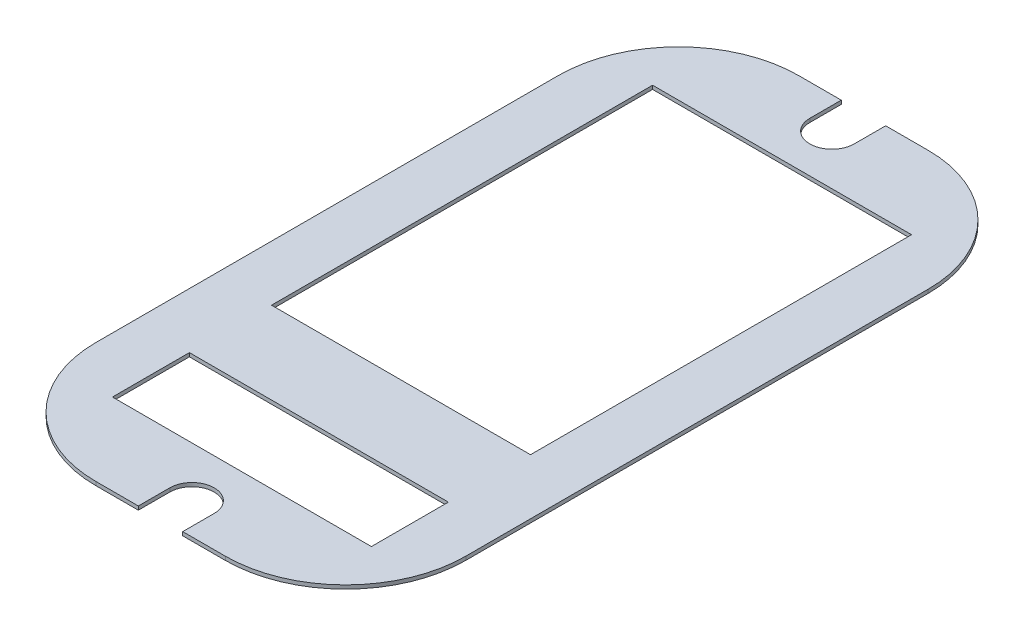
ISO-10303-21;
HEADER;
FILE_DESCRIPTION(('STEP AP214'),'2;1');
FILE_NAME('part.step','',(''),(''),'','','');
FILE_SCHEMA(('AUTOMOTIVE_DESIGN { 1 0 10303 214 1 1 1 1 }'));
ENDSEC;
DATA;
#1=APPLICATION_CONTEXT('core data for automotive mechanical design processes');
#2=APPLICATION_PROTOCOL_DEFINITION('international standard','automotive_design',2000,#1);
#3=PRODUCT_CONTEXT('',#1,'mechanical');
#4=PRODUCT('Part','Part','',(#3));
#5=PRODUCT_RELATED_PRODUCT_CATEGORY('part','',(#4));
#6=PRODUCT_DEFINITION_FORMATION('','',#4);
#7=PRODUCT_DEFINITION_CONTEXT('part definition',#1,'design');
#8=PRODUCT_DEFINITION('design','',#6,#7);
#9=PRODUCT_DEFINITION_SHAPE('','',#8);
#10=(LENGTH_UNIT() NAMED_UNIT(*) SI_UNIT(.MILLI.,.METRE.));
#11=(NAMED_UNIT(*) PLANE_ANGLE_UNIT() SI_UNIT($,.RADIAN.));
#12=(NAMED_UNIT(*) SI_UNIT($,.STERADIAN.) SOLID_ANGLE_UNIT());
#13=UNCERTAINTY_MEASURE_WITH_UNIT(LENGTH_MEASURE(1.E-05),#10,'distance_accuracy_value','');
#14=(GEOMETRIC_REPRESENTATION_CONTEXT(3) GLOBAL_UNCERTAINTY_ASSIGNED_CONTEXT((#13)) GLOBAL_UNIT_ASSIGNED_CONTEXT((#10,
#11,#12)) REPRESENTATION_CONTEXT('',''));
#15=CARTESIAN_POINT('',(0.,0.,0.));
#16=DIRECTION('',(0.,0.,1.));
#17=DIRECTION('',(1.,0.,0.));
#18=AXIS2_PLACEMENT_3D('',#15,#16,#17);
#19=CARTESIAN_POINT('',(0.,0.1,-8.65));
#20=DIRECTION('',(0.,1.,0.));
#21=DIRECTION('',(0.,0.,1.));
#22=AXIS2_PLACEMENT_3D('',#19,#20,#21);
#23=PLANE('',#22);
#24=CARTESIAN_POINT('',(0.,0.1,-8.65));
#25=DIRECTION('',(0.,-1.,0.));
#26=DIRECTION('',(0.,0.,1.));
#27=AXIS2_PLACEMENT_3D('',#24,#25,#26);
#28=CIRCLE('',#27,0.599999999999999);
#29=CARTESIAN_POINT('',(0.599999999999996,0.1,-8.65));
#30=VERTEX_POINT('',#29);
#31=CARTESIAN_POINT('',(-0.600000000000002,0.1,-8.65));
#32=VERTEX_POINT('',#31);
#33=EDGE_CURVE('E261',#30,#32,#28,.T.);
#34=ORIENTED_EDGE('',*,*,#33,.T.);
#35=DIRECTION('',(0.,0.,-1.));
#36=VECTOR('',#35,1.);
#37=CARTESIAN_POINT('',(-0.600000000000005,0.1,-9.5));
#38=LINE('',#37,#36);
#39=CARTESIAN_POINT('',(-0.600000000000005,0.1,-9.5));
#40=VERTEX_POINT('',#39);
#41=EDGE_CURVE('E264',#32,#40,#38,.T.);
#42=ORIENTED_EDGE('',*,*,#41,.T.);
#43=DIRECTION('',(-1.,0.,0.));
#44=VECTOR('',#43,1.);
#45=CARTESIAN_POINT('',(-0.600000000000005,0.1,-9.5));
#46=LINE('',#45,#44);
#47=CARTESIAN_POINT('',(-1.75000000000001,0.1,-9.5));
#48=VERTEX_POINT('',#47);
#49=EDGE_CURVE('E267',#40,#48,#46,.T.);
#50=ORIENTED_EDGE('',*,*,#49,.T.);
#51=CARTESIAN_POINT('',(-1.75000000000001,0.1,-6.25));
#52=DIRECTION('',(0.,1.,0.));
#53=DIRECTION('',(0.,0.,1.));
#54=AXIS2_PLACEMENT_3D('',#51,#52,#53);
#55=CIRCLE('',#54,3.25);
#56=CARTESIAN_POINT('',(-5.,0.1,-6.25));
#57=VERTEX_POINT('',#56);
#58=EDGE_CURVE('E269',#48,#57,#55,.T.);
#59=ORIENTED_EDGE('',*,*,#58,.T.);
#60=DIRECTION('',(0.,0.,1.));
#61=VECTOR('',#60,1.);
#62=CARTESIAN_POINT('',(-5.,0.1,-6.25));
#63=LINE('',#62,#61);
#64=CARTESIAN_POINT('',(-5.,0.1,6.25000000000001));
#65=VERTEX_POINT('',#64);
#66=EDGE_CURVE('E271',#57,#65,#63,.T.);
#67=ORIENTED_EDGE('',*,*,#66,.T.);
#68=CARTESIAN_POINT('',(-1.75000000000001,0.1,6.25000000000001));
#69=DIRECTION('',(0.,1.,0.));
#70=DIRECTION('',(0.,0.,1.));
#71=AXIS2_PLACEMENT_3D('',#68,#69,#70);
#72=CIRCLE('',#71,3.24999999999999);
#73=CARTESIAN_POINT('',(-1.75,0.1,9.5));
#74=VERTEX_POINT('',#73);
#75=EDGE_CURVE('E273',#65,#74,#72,.T.);
#76=ORIENTED_EDGE('',*,*,#75,.T.);
#77=DIRECTION('',(1.,0.,0.));
#78=VECTOR('',#77,1.);
#79=CARTESIAN_POINT('',(-1.75000000000001,0.1,9.5));
#80=LINE('',#79,#78);
#81=CARTESIAN_POINT('',(-0.600000000000005,0.1,9.5));
#82=VERTEX_POINT('',#81);
#83=EDGE_CURVE('E275',#74,#82,#80,.T.);
#84=ORIENTED_EDGE('',*,*,#83,.T.);
#85=DIRECTION('',(0.,0.,-1.));
#86=VECTOR('',#85,1.);
#87=CARTESIAN_POINT('',(-0.599999999999991,0.1,8.65));
#88=LINE('',#87,#86);
#89=CARTESIAN_POINT('',(-0.599999999999991,0.1,8.65));
#90=VERTEX_POINT('',#89);
#91=EDGE_CURVE('E277',#82,#90,#88,.T.);
#92=ORIENTED_EDGE('',*,*,#91,.T.);
#93=CARTESIAN_POINT('',(0.,0.1,8.65));
#94=DIRECTION('',(0.,-1.,0.));
#95=DIRECTION('',(0.,0.,1.));
#96=AXIS2_PLACEMENT_3D('',#93,#94,#95);
#97=CIRCLE('',#96,0.599999999999996);
#98=CARTESIAN_POINT('',(0.599999999999998,0.1,8.65));
#99=VERTEX_POINT('',#98);
#100=EDGE_CURVE('E279',#90,#99,#97,.T.);
#101=ORIENTED_EDGE('',*,*,#100,.T.);
#102=DIRECTION('',(0.,0.,1.));
#103=VECTOR('',#102,1.);
#104=CARTESIAN_POINT('',(0.600000000000001,0.1,8.65));
#105=LINE('',#104,#103);
#106=CARTESIAN_POINT('',(0.599999999999993,0.1,9.5));
#107=VERTEX_POINT('',#106);
#108=EDGE_CURVE('E281',#99,#107,#105,.T.);
#109=ORIENTED_EDGE('',*,*,#108,.T.);
#110=DIRECTION('',(1.,0.,0.));
#111=VECTOR('',#110,1.);
#112=CARTESIAN_POINT('',(0.599999999999993,0.1,9.5));
#113=LINE('',#112,#111);
#114=CARTESIAN_POINT('',(1.75,0.1,9.5));
#115=VERTEX_POINT('',#114);
#116=EDGE_CURVE('E283',#107,#115,#113,.T.);
#117=ORIENTED_EDGE('',*,*,#116,.T.);
#118=CARTESIAN_POINT('',(1.75000000000001,0.1,6.25));
#119=DIRECTION('',(0.,1.,0.));
#120=DIRECTION('',(0.,0.,1.));
#121=AXIS2_PLACEMENT_3D('',#118,#119,#120);
#122=CIRCLE('',#121,3.25);
#123=CARTESIAN_POINT('',(5.,0.1,6.25000000000001));
#124=VERTEX_POINT('',#123);
#125=EDGE_CURVE('E285',#115,#124,#122,.T.);
#126=ORIENTED_EDGE('',*,*,#125,.T.);
#127=DIRECTION('',(0.,0.,-1.));
#128=VECTOR('',#127,1.);
#129=CARTESIAN_POINT('',(5.,0.1,6.25000000000001));
#130=LINE('',#129,#128);
#131=CARTESIAN_POINT('',(5.,0.1,-6.25));
#132=VERTEX_POINT('',#131);
#133=EDGE_CURVE('E287',#124,#132,#130,.T.);
#134=ORIENTED_EDGE('',*,*,#133,.T.);
#135=CARTESIAN_POINT('',(1.75,0.1,-6.25));
#136=DIRECTION('',(0.,1.,0.));
#137=DIRECTION('',(0.,0.,1.));
#138=AXIS2_PLACEMENT_3D('',#135,#136,#137);
#139=CIRCLE('',#138,3.25);
#140=CARTESIAN_POINT('',(1.75,0.1,-9.5));
#141=VERTEX_POINT('',#140);
#142=EDGE_CURVE('E289',#132,#141,#139,.T.);
#143=ORIENTED_EDGE('',*,*,#142,.T.);
#144=DIRECTION('',(-1.,0.,0.));
#145=VECTOR('',#144,1.);
#146=CARTESIAN_POINT('',(1.75,0.1,-9.5));
#147=LINE('',#146,#145);
#148=CARTESIAN_POINT('',(0.599999999999993,0.1,-9.5));
#149=VERTEX_POINT('',#148);
#150=EDGE_CURVE('E291',#141,#149,#147,.T.);
#151=ORIENTED_EDGE('',*,*,#150,.T.);
#152=DIRECTION('',(0.,0.,1.));
#153=VECTOR('',#152,1.);
#154=CARTESIAN_POINT('',(0.599999999999993,0.1,-9.5));
#155=LINE('',#154,#153);
#156=EDGE_CURVE('E293',#149,#30,#155,.T.);
#157=ORIENTED_EDGE('',*,*,#156,.T.);
#158=EDGE_LOOP('',(#34,#42,#50,#59,#67,#76,#84,#92,#101,#109,#117,#126,#134,#143,#151,#157));
#159=FACE_BOUND('',#158,.T.);
#160=DIRECTION('',(1.,0.,0.));
#161=VECTOR('',#160,1.);
#162=CARTESIAN_POINT('',(-3.5,0.1,3.));
#163=LINE('',#162,#161);
#164=CARTESIAN_POINT('',(-3.5,0.1,3.));
#165=VERTEX_POINT('',#164);
#166=CARTESIAN_POINT('',(3.5,0.1,3.));
#167=VERTEX_POINT('',#166);
#168=EDGE_CURVE('E232',#165,#167,#163,.T.);
#169=ORIENTED_EDGE('',*,*,#168,.F.);
#170=DIRECTION('',(0.,0.,1.));
#171=VECTOR('',#170,1.);
#172=CARTESIAN_POINT('',(-3.5,0.1,-7.3));
#173=LINE('',#172,#171);
#174=CARTESIAN_POINT('',(-3.5,0.1,-7.3));
#175=VERTEX_POINT('',#174);
#176=EDGE_CURVE('E230',#175,#165,#173,.T.);
#177=ORIENTED_EDGE('',*,*,#176,.F.);
#178=DIRECTION('',(-1.,0.,0.));
#179=VECTOR('',#178,1.);
#180=CARTESIAN_POINT('',(3.5,0.1,-7.3));
#181=LINE('',#180,#179);
#182=CARTESIAN_POINT('',(3.5,0.1,-7.3));
#183=VERTEX_POINT('',#182);
#184=EDGE_CURVE('E238',#183,#175,#181,.T.);
#185=ORIENTED_EDGE('',*,*,#184,.F.);
#186=DIRECTION('',(0.,0.,-1.));
#187=VECTOR('',#186,1.);
#188=CARTESIAN_POINT('',(3.5,0.1,3.));
#189=LINE('',#188,#187);
#190=EDGE_CURVE('E235',#167,#183,#189,.T.);
#191=ORIENTED_EDGE('',*,*,#190,.F.);
#192=EDGE_LOOP('',(#169,#177,#185,#191));
#193=FACE_BOUND('',#192,.T.);
#194=DIRECTION('',(1.,0.,0.));
#195=VECTOR('',#194,1.);
#196=CARTESIAN_POINT('',(-3.5,0.1,7.3));
#197=LINE('',#196,#195);
#198=CARTESIAN_POINT('',(-3.5,0.1,7.3));
#199=VERTEX_POINT('',#198);
#200=CARTESIAN_POINT('',(3.5,0.1,7.3));
#201=VERTEX_POINT('',#200);
#202=EDGE_CURVE('E202',#199,#201,#197,.T.);
#203=ORIENTED_EDGE('',*,*,#202,.F.);
#204=DIRECTION('',(0.,0.,1.));
#205=VECTOR('',#204,1.);
#206=CARTESIAN_POINT('',(-3.5,0.1,5.22));
#207=LINE('',#206,#205);
#208=CARTESIAN_POINT('',(-3.5,0.1,5.22));
#209=VERTEX_POINT('',#208);
#210=EDGE_CURVE('E194',#209,#199,#207,.T.);
#211=ORIENTED_EDGE('',*,*,#210,.F.);
#212=DIRECTION('',(-1.,0.,0.));
#213=VECTOR('',#212,1.);
#214=CARTESIAN_POINT('',(3.5,0.1,5.22));
#215=LINE('',#214,#213);
#216=CARTESIAN_POINT('',(3.5,0.1,5.22));
#217=VERTEX_POINT('',#216);
#218=EDGE_CURVE('E216',#217,#209,#215,.T.);
#219=ORIENTED_EDGE('',*,*,#218,.F.);
#220=DIRECTION('',(0.,0.,-1.));
#221=VECTOR('',#220,1.);
#222=CARTESIAN_POINT('',(3.5,0.1,7.3));
#223=LINE('',#222,#221);
#224=EDGE_CURVE('E214',#201,#217,#223,.T.);
#225=ORIENTED_EDGE('',*,*,#224,.F.);
#226=EDGE_LOOP('',(#203,#211,#219,#225));
#227=FACE_BOUND('',#226,.T.);
#228=ADVANCED_FACE('F33',(#159,#193,#227),#23,.T.);
#229=CARTESIAN_POINT('',(0.,0.,-8.65));
#230=DIRECTION('',(0.,1.,0.));
#231=DIRECTION('',(0.,0.,1.));
#232=AXIS2_PLACEMENT_3D('',#229,#230,#231);
#233=PLANE('',#232);
#234=DIRECTION('',(0.,0.,1.));
#235=VECTOR('',#234,1.);
#236=CARTESIAN_POINT('',(-3.5,0.,-7.3));
#237=LINE('',#236,#235);
#238=CARTESIAN_POINT('',(-3.5,0.,-7.3));
#239=VERTEX_POINT('',#238);
#240=CARTESIAN_POINT('',(-3.5,0.,3.));
#241=VERTEX_POINT('',#240);
#242=EDGE_CURVE('E210',#239,#241,#237,.T.);
#243=ORIENTED_EDGE('',*,*,#242,.T.);
#244=DIRECTION('',(1.,0.,0.));
#245=VECTOR('',#244,1.);
#246=CARTESIAN_POINT('',(-3.5,0.,3.));
#247=LINE('',#246,#245);
#248=CARTESIAN_POINT('',(3.5,0.,3.));
#249=VERTEX_POINT('',#248);
#250=EDGE_CURVE('E243',#241,#249,#247,.T.);
#251=ORIENTED_EDGE('',*,*,#250,.T.);
#252=DIRECTION('',(0.,0.,-1.));
#253=VECTOR('',#252,1.);
#254=CARTESIAN_POINT('',(3.5,0.,3.));
#255=LINE('',#254,#253);
#256=CARTESIAN_POINT('',(3.5,0.,-7.3));
#257=VERTEX_POINT('',#256);
#258=EDGE_CURVE('E246',#249,#257,#255,.T.);
#259=ORIENTED_EDGE('',*,*,#258,.T.);
#260=DIRECTION('',(-1.,0.,0.));
#261=VECTOR('',#260,1.);
#262=CARTESIAN_POINT('',(3.5,0.,-7.3));
#263=LINE('',#262,#261);
#264=EDGE_CURVE('E233',#257,#239,#263,.T.);
#265=ORIENTED_EDGE('',*,*,#264,.T.);
#266=EDGE_LOOP('',(#243,#251,#259,#265));
#267=FACE_BOUND('',#266,.T.);
#268=CARTESIAN_POINT('',(0.,0.,-8.65));
#269=DIRECTION('',(0.,-1.,0.));
#270=DIRECTION('',(0.,0.,1.));
#271=AXIS2_PLACEMENT_3D('',#268,#269,#270);
#272=CIRCLE('',#271,0.599999999999999);
#273=CARTESIAN_POINT('',(0.599999999999996,0.,-8.65));
#274=VERTEX_POINT('',#273);
#275=CARTESIAN_POINT('',(-0.600000000000002,0.,-8.65));
#276=VERTEX_POINT('',#275);
#277=EDGE_CURVE('E260',#274,#276,#272,.T.);
#278=ORIENTED_EDGE('',*,*,#277,.F.);
#279=DIRECTION('',(0.,0.,1.));
#280=VECTOR('',#279,1.);
#281=CARTESIAN_POINT('',(0.599999999999993,0.,-9.5));
#282=LINE('',#281,#280);
#283=CARTESIAN_POINT('',(0.599999999999993,0.,-9.5));
#284=VERTEX_POINT('',#283);
#285=EDGE_CURVE('E265',#284,#274,#282,.T.);
#286=ORIENTED_EDGE('',*,*,#285,.F.);
#287=DIRECTION('',(-1.,0.,0.));
#288=VECTOR('',#287,1.);
#289=CARTESIAN_POINT('',(1.75,0.,-9.5));
#290=LINE('',#289,#288);
#291=CARTESIAN_POINT('',(1.75,0.,-9.5));
#292=VERTEX_POINT('',#291);
#293=EDGE_CURVE('E324',#292,#284,#290,.T.);
#294=ORIENTED_EDGE('',*,*,#293,.F.);
#295=CARTESIAN_POINT('',(1.75,0.,-6.25));
#296=DIRECTION('',(0.,1.,0.));
#297=DIRECTION('',(0.,0.,1.));
#298=AXIS2_PLACEMENT_3D('',#295,#296,#297);
#299=CIRCLE('',#298,3.25);
#300=CARTESIAN_POINT('',(5.,0.,-6.25));
#301=VERTEX_POINT('',#300);
#302=EDGE_CURVE('E322',#301,#292,#299,.T.);
#303=ORIENTED_EDGE('',*,*,#302,.F.);
#304=DIRECTION('',(0.,0.,-1.));
#305=VECTOR('',#304,1.);
#306=CARTESIAN_POINT('',(5.,0.,6.25000000000001));
#307=LINE('',#306,#305);
#308=CARTESIAN_POINT('',(5.,0.,6.25000000000001));
#309=VERTEX_POINT('',#308);
#310=EDGE_CURVE('E320',#309,#301,#307,.T.);
#311=ORIENTED_EDGE('',*,*,#310,.F.);
#312=CARTESIAN_POINT('',(1.75000000000001,0.,6.25));
#313=DIRECTION('',(0.,1.,0.));
#314=DIRECTION('',(0.,0.,1.));
#315=AXIS2_PLACEMENT_3D('',#312,#313,#314);
#316=CIRCLE('',#315,3.25);
#317=CARTESIAN_POINT('',(1.75,0.,9.5));
#318=VERTEX_POINT('',#317);
#319=EDGE_CURVE('E318',#318,#309,#316,.T.);
#320=ORIENTED_EDGE('',*,*,#319,.F.);
#321=DIRECTION('',(1.,0.,0.));
#322=VECTOR('',#321,1.);
#323=CARTESIAN_POINT('',(0.599999999999993,0.,9.5));
#324=LINE('',#323,#322);
#325=CARTESIAN_POINT('',(0.599999999999993,0.,9.5));
#326=VERTEX_POINT('',#325);
#327=EDGE_CURVE('E316',#326,#318,#324,.T.);
#328=ORIENTED_EDGE('',*,*,#327,.F.);
#329=DIRECTION('',(0.,0.,1.));
#330=VECTOR('',#329,1.);
#331=CARTESIAN_POINT('',(0.600000000000001,0.,8.65));
#332=LINE('',#331,#330);
#333=CARTESIAN_POINT('',(0.599999999999998,0.,8.65));
#334=VERTEX_POINT('',#333);
#335=EDGE_CURVE('E314',#334,#326,#332,.T.);
#336=ORIENTED_EDGE('',*,*,#335,.F.);
#337=CARTESIAN_POINT('',(0.,0.,8.65));
#338=DIRECTION('',(0.,-1.,0.));
#339=DIRECTION('',(0.,0.,1.));
#340=AXIS2_PLACEMENT_3D('',#337,#338,#339);
#341=CIRCLE('',#340,0.599999999999996);
#342=CARTESIAN_POINT('',(-0.599999999999991,0.,8.65));
#343=VERTEX_POINT('',#342);
#344=EDGE_CURVE('E312',#343,#334,#341,.T.);
#345=ORIENTED_EDGE('',*,*,#344,.F.);
#346=DIRECTION('',(0.,0.,-1.));
#347=VECTOR('',#346,1.);
#348=CARTESIAN_POINT('',(-0.599999999999991,0.,8.65));
#349=LINE('',#348,#347);
#350=CARTESIAN_POINT('',(-0.600000000000005,0.,9.5));
#351=VERTEX_POINT('',#350);
#352=EDGE_CURVE('E310',#351,#343,#349,.T.);
#353=ORIENTED_EDGE('',*,*,#352,.F.);
#354=DIRECTION('',(1.,0.,0.));
#355=VECTOR('',#354,1.);
#356=CARTESIAN_POINT('',(-1.75000000000001,0.,9.5));
#357=LINE('',#356,#355);
#358=CARTESIAN_POINT('',(-1.75,0.,9.5));
#359=VERTEX_POINT('',#358);
#360=EDGE_CURVE('E308',#359,#351,#357,.T.);
#361=ORIENTED_EDGE('',*,*,#360,.F.);
#362=CARTESIAN_POINT('',(-1.75000000000001,0.,6.25000000000001));
#363=DIRECTION('',(0.,1.,0.));
#364=DIRECTION('',(0.,0.,1.));
#365=AXIS2_PLACEMENT_3D('',#362,#363,#364);
#366=CIRCLE('',#365,3.24999999999999);
#367=CARTESIAN_POINT('',(-5.,0.,6.25000000000001));
#368=VERTEX_POINT('',#367);
#369=EDGE_CURVE('E306',#368,#359,#366,.T.);
#370=ORIENTED_EDGE('',*,*,#369,.F.);
#371=DIRECTION('',(0.,0.,1.));
#372=VECTOR('',#371,1.);
#373=CARTESIAN_POINT('',(-5.,0.,-6.25));
#374=LINE('',#373,#372);
#375=CARTESIAN_POINT('',(-5.,0.,-6.25));
#376=VERTEX_POINT('',#375);
#377=EDGE_CURVE('E304',#376,#368,#374,.T.);
#378=ORIENTED_EDGE('',*,*,#377,.F.);
#379=CARTESIAN_POINT('',(-1.75000000000001,0.,-6.25));
#380=DIRECTION('',(0.,1.,0.));
#381=DIRECTION('',(0.,0.,1.));
#382=AXIS2_PLACEMENT_3D('',#379,#380,#381);
#383=CIRCLE('',#382,3.25);
#384=CARTESIAN_POINT('',(-1.75000000000001,0.,-9.5));
#385=VERTEX_POINT('',#384);
#386=EDGE_CURVE('E302',#385,#376,#383,.T.);
#387=ORIENTED_EDGE('',*,*,#386,.F.);
#388=DIRECTION('',(-1.,0.,0.));
#389=VECTOR('',#388,1.);
#390=CARTESIAN_POINT('',(-0.600000000000005,0.,-9.5));
#391=LINE('',#390,#389);
#392=CARTESIAN_POINT('',(-0.600000000000005,0.,-9.5));
#393=VERTEX_POINT('',#392);
#394=EDGE_CURVE('E300',#393,#385,#391,.T.);
#395=ORIENTED_EDGE('',*,*,#394,.F.);
#396=DIRECTION('',(0.,0.,-1.));
#397=VECTOR('',#396,1.);
#398=CARTESIAN_POINT('',(-0.600000000000005,0.,-9.5));
#399=LINE('',#398,#397);
#400=EDGE_CURVE('E298',#276,#393,#399,.T.);
#401=ORIENTED_EDGE('',*,*,#400,.F.);
#402=EDGE_LOOP('',(#278,#286,#294,#303,#311,#320,#328,#336,#345,#353,#361,#370,#378,#387,#395,#401));
#403=FACE_BOUND('',#402,.T.);
#404=DIRECTION('',(0.,0.,1.));
#405=VECTOR('',#404,1.);
#406=CARTESIAN_POINT('',(-3.5,0.,5.22));
#407=LINE('',#406,#405);
#408=CARTESIAN_POINT('',(-3.5,0.,5.22));
#409=VERTEX_POINT('',#408);
#410=CARTESIAN_POINT('',(-3.5,0.,7.3));
#411=VERTEX_POINT('',#410);
#412=EDGE_CURVE('E56',#409,#411,#407,.T.);
#413=ORIENTED_EDGE('',*,*,#412,.T.);
#414=DIRECTION('',(1.,0.,0.));
#415=VECTOR('',#414,1.);
#416=CARTESIAN_POINT('',(-3.5,0.,7.3));
#417=LINE('',#416,#415);
#418=CARTESIAN_POINT('',(3.5,0.,7.3));
#419=VERTEX_POINT('',#418);
#420=EDGE_CURVE('E209',#411,#419,#417,.T.);
#421=ORIENTED_EDGE('',*,*,#420,.T.);
#422=DIRECTION('',(0.,0.,-1.));
#423=VECTOR('',#422,1.);
#424=CARTESIAN_POINT('',(3.5,0.,7.3));
#425=LINE('',#424,#423);
#426=CARTESIAN_POINT('',(3.5,0.,5.22));
#427=VERTEX_POINT('',#426);
#428=EDGE_CURVE('E222',#419,#427,#425,.T.);
#429=ORIENTED_EDGE('',*,*,#428,.T.);
#430=DIRECTION('',(-1.,0.,0.));
#431=VECTOR('',#430,1.);
#432=CARTESIAN_POINT('',(3.5,0.,5.22));
#433=LINE('',#432,#431);
#434=EDGE_CURVE('E203',#427,#409,#433,.T.);
#435=ORIENTED_EDGE('',*,*,#434,.T.);
#436=EDGE_LOOP('',(#413,#421,#429,#435));
#437=FACE_BOUND('',#436,.T.);
#438=ADVANCED_FACE('F378',(#267,#403,#437),#233,.F.);
#439=CARTESIAN_POINT('',(0.,0.1,-8.65));
#440=DIRECTION('',(0.,-1.,0.));
#441=DIRECTION('',(0.,0.,-1.));
#442=AXIS2_PLACEMENT_3D('',#439,#440,#441);
#443=CYLINDRICAL_SURFACE('',#442,0.599999999999999);
#444=ORIENTED_EDGE('',*,*,#277,.T.);
#445=DIRECTION('',(0.,-1.,0.));
#446=VECTOR('',#445,1.);
#447=CARTESIAN_POINT('',(-0.600000000000002,0.1,-8.65));
#448=LINE('',#447,#446);
#449=EDGE_CURVE('E11',#32,#276,#448,.T.);
#450=ORIENTED_EDGE('',*,*,#449,.F.);
#451=ORIENTED_EDGE('',*,*,#33,.F.);
#452=DIRECTION('',(0.,-1.,0.));
#453=VECTOR('',#452,1.);
#454=CARTESIAN_POINT('',(0.599999999999996,0.1,-8.65));
#455=LINE('',#454,#453);
#456=EDGE_CURVE('E295',#30,#274,#455,.T.);
#457=ORIENTED_EDGE('',*,*,#456,.T.);
#458=EDGE_LOOP('',(#444,#450,#451,#457));
#459=FACE_BOUND('',#458,.T.);
#460=ADVANCED_FACE('F35',(#459),#443,.F.);
#461=CARTESIAN_POINT('',(-0.600000000000005,0.1,-9.5));
#462=DIRECTION('',(-1.,0.,0.));
#463=DIRECTION('',(0.,0.,1.));
#464=AXIS2_PLACEMENT_3D('',#461,#462,#463);
#465=PLANE('',#464);
#466=ORIENTED_EDGE('',*,*,#400,.T.);
#467=DIRECTION('',(0.,-1.,0.));
#468=VECTOR('',#467,1.);
#469=CARTESIAN_POINT('',(-0.600000000000005,0.1,-9.5));
#470=LINE('',#469,#468);
#471=EDGE_CURVE('E41',#40,#393,#470,.T.);
#472=ORIENTED_EDGE('',*,*,#471,.F.);
#473=ORIENTED_EDGE('',*,*,#41,.F.);
#474=ORIENTED_EDGE('',*,*,#449,.T.);
#475=EDGE_LOOP('',(#466,#472,#473,#474));
#476=FACE_BOUND('',#475,.T.);
#477=ADVANCED_FACE('F396',(#476),#465,.F.);
#478=CARTESIAN_POINT('',(-0.600000000000005,0.1,-9.5));
#479=DIRECTION('',(0.,0.,1.));
#480=DIRECTION('',(1.,0.,0.));
#481=AXIS2_PLACEMENT_3D('',#478,#479,#480);
#482=PLANE('',#481);
#483=ORIENTED_EDGE('',*,*,#394,.T.);
#484=DIRECTION('',(0.,-1.,0.));
#485=VECTOR('',#484,1.);
#486=CARTESIAN_POINT('',(-1.75000000000001,0.1,-9.5));
#487=LINE('',#486,#485);
#488=EDGE_CURVE('E365',#48,#385,#487,.T.);
#489=ORIENTED_EDGE('',*,*,#488,.F.);
#490=ORIENTED_EDGE('',*,*,#49,.F.);
#491=ORIENTED_EDGE('',*,*,#471,.T.);
#492=EDGE_LOOP('',(#483,#489,#490,#491));
#493=FACE_BOUND('',#492,.T.);
#494=ADVANCED_FACE('F372',(#493),#482,.F.);
#495=CARTESIAN_POINT('',(-1.75000000000001,0.1,-6.25));
#496=DIRECTION('',(0.,-1.,0.));
#497=DIRECTION('',(0.,0.,-1.));
#498=AXIS2_PLACEMENT_3D('',#495,#496,#497);
#499=CYLINDRICAL_SURFACE('',#498,3.25);
#500=ORIENTED_EDGE('',*,*,#386,.T.);
#501=DIRECTION('',(0.,-1.,0.));
#502=VECTOR('',#501,1.);
#503=CARTESIAN_POINT('',(-5.,0.1,-6.25));
#504=LINE('',#503,#502);
#505=EDGE_CURVE('E362',#57,#376,#504,.T.);
#506=ORIENTED_EDGE('',*,*,#505,.F.);
#507=ORIENTED_EDGE('',*,*,#58,.F.);
#508=ORIENTED_EDGE('',*,*,#488,.T.);
#509=EDGE_LOOP('',(#500,#506,#507,#508));
#510=FACE_BOUND('',#509,.T.);
#511=ADVANCED_FACE('F384',(#510),#499,.T.);
#512=CARTESIAN_POINT('',(-5.,0.1,-6.25));
#513=DIRECTION('',(1.,0.,0.));
#514=DIRECTION('',(0.,0.,-1.));
#515=AXIS2_PLACEMENT_3D('',#512,#513,#514);
#516=PLANE('',#515);
#517=ORIENTED_EDGE('',*,*,#377,.T.);
#518=DIRECTION('',(0.,-1.,0.));
#519=VECTOR('',#518,1.);
#520=CARTESIAN_POINT('',(-5.,0.1,6.25000000000001));
#521=LINE('',#520,#519);
#522=EDGE_CURVE('E359',#65,#368,#521,.T.);
#523=ORIENTED_EDGE('',*,*,#522,.F.);
#524=ORIENTED_EDGE('',*,*,#66,.F.);
#525=ORIENTED_EDGE('',*,*,#505,.T.);
#526=EDGE_LOOP('',(#517,#523,#524,#525));
#527=FACE_BOUND('',#526,.T.);
#528=ADVANCED_FACE('F388',(#527),#516,.F.);
#529=CARTESIAN_POINT('',(-1.75000000000001,0.1,6.25000000000001));
#530=DIRECTION('',(0.,-1.,0.));
#531=DIRECTION('',(0.,0.,-1.));
#532=AXIS2_PLACEMENT_3D('',#529,#530,#531);
#533=CYLINDRICAL_SURFACE('',#532,3.24999999999999);
#534=ORIENTED_EDGE('',*,*,#369,.T.);
#535=DIRECTION('',(0.,-1.,0.));
#536=VECTOR('',#535,1.);
#537=CARTESIAN_POINT('',(-1.75,0.1,9.5));
#538=LINE('',#537,#536);
#539=EDGE_CURVE('E356',#74,#359,#538,.T.);
#540=ORIENTED_EDGE('',*,*,#539,.F.);
#541=ORIENTED_EDGE('',*,*,#75,.F.);
#542=ORIENTED_EDGE('',*,*,#522,.T.);
#543=EDGE_LOOP('',(#534,#540,#541,#542));
#544=FACE_BOUND('',#543,.T.);
#545=ADVANCED_FACE('F449',(#544),#533,.T.);
#546=CARTESIAN_POINT('',(-1.75000000000001,0.1,9.5));
#547=DIRECTION('',(0.,0.,-1.));
#548=DIRECTION('',(-1.,0.,0.));
#549=AXIS2_PLACEMENT_3D('',#546,#547,#548);
#550=PLANE('',#549);
#551=ORIENTED_EDGE('',*,*,#360,.T.);
#552=DIRECTION('',(0.,-1.,0.));
#553=VECTOR('',#552,1.);
#554=CARTESIAN_POINT('',(-0.600000000000005,0.1,9.5));
#555=LINE('',#554,#553);
#556=EDGE_CURVE('E353',#82,#351,#555,.T.);
#557=ORIENTED_EDGE('',*,*,#556,.F.);
#558=ORIENTED_EDGE('',*,*,#83,.F.);
#559=ORIENTED_EDGE('',*,*,#539,.T.);
#560=EDGE_LOOP('',(#551,#557,#558,#559));
#561=FACE_BOUND('',#560,.T.);
#562=ADVANCED_FACE('F446',(#561),#550,.F.);
#563=CARTESIAN_POINT('',(-0.599999999999991,0.1,8.65));
#564=DIRECTION('',(-1.,0.,0.));
#565=DIRECTION('',(0.,0.,1.));
#566=AXIS2_PLACEMENT_3D('',#563,#564,#565);
#567=PLANE('',#566);
#568=ORIENTED_EDGE('',*,*,#352,.T.);
#569=DIRECTION('',(0.,-1.,0.));
#570=VECTOR('',#569,1.);
#571=CARTESIAN_POINT('',(-0.599999999999991,0.1,8.65));
#572=LINE('',#571,#570);
#573=EDGE_CURVE('E350',#90,#343,#572,.T.);
#574=ORIENTED_EDGE('',*,*,#573,.F.);
#575=ORIENTED_EDGE('',*,*,#91,.F.);
#576=ORIENTED_EDGE('',*,*,#556,.T.);
#577=EDGE_LOOP('',(#568,#574,#575,#576));
#578=FACE_BOUND('',#577,.T.);
#579=ADVANCED_FACE('F442',(#578),#567,.F.);
#580=CARTESIAN_POINT('',(0.,0.1,8.65));
#581=DIRECTION('',(0.,-1.,0.));
#582=DIRECTION('',(0.,0.,-1.));
#583=AXIS2_PLACEMENT_3D('',#580,#581,#582);
#584=CYLINDRICAL_SURFACE('',#583,0.599999999999996);
#585=ORIENTED_EDGE('',*,*,#344,.T.);
#586=DIRECTION('',(0.,-1.,0.));
#587=VECTOR('',#586,1.);
#588=CARTESIAN_POINT('',(0.599999999999998,0.1,8.65));
#589=LINE('',#588,#587);
#590=EDGE_CURVE('E347',#99,#334,#589,.T.);
#591=ORIENTED_EDGE('',*,*,#590,.F.);
#592=ORIENTED_EDGE('',*,*,#100,.F.);
#593=ORIENTED_EDGE('',*,*,#573,.T.);
#594=EDGE_LOOP('',(#585,#591,#592,#593));
#595=FACE_BOUND('',#594,.T.);
#596=ADVANCED_FACE('F438',(#595),#584,.F.);
#597=CARTESIAN_POINT('',(0.600000000000001,0.1,8.65));
#598=DIRECTION('',(1.,0.,0.));
#599=DIRECTION('',(0.,0.,-1.));
#600=AXIS2_PLACEMENT_3D('',#597,#598,#599);
#601=PLANE('',#600);
#602=ORIENTED_EDGE('',*,*,#335,.T.);
#603=DIRECTION('',(0.,-1.,0.));
#604=VECTOR('',#603,1.);
#605=CARTESIAN_POINT('',(0.599999999999993,0.1,9.5));
#606=LINE('',#605,#604);
#607=EDGE_CURVE('E344',#107,#326,#606,.T.);
#608=ORIENTED_EDGE('',*,*,#607,.F.);
#609=ORIENTED_EDGE('',*,*,#108,.F.);
#610=ORIENTED_EDGE('',*,*,#590,.T.);
#611=EDGE_LOOP('',(#602,#608,#609,#610));
#612=FACE_BOUND('',#611,.T.);
#613=ADVANCED_FACE('F433',(#612),#601,.F.);
#614=CARTESIAN_POINT('',(0.599999999999993,0.1,9.5));
#615=DIRECTION('',(0.,0.,-1.));
#616=DIRECTION('',(-1.,0.,0.));
#617=AXIS2_PLACEMENT_3D('',#614,#615,#616);
#618=PLANE('',#617);
#619=ORIENTED_EDGE('',*,*,#327,.T.);
#620=DIRECTION('',(0.,-1.,0.));
#621=VECTOR('',#620,1.);
#622=CARTESIAN_POINT('',(1.75,0.1,9.5));
#623=LINE('',#622,#621);
#624=EDGE_CURVE('E341',#115,#318,#623,.T.);
#625=ORIENTED_EDGE('',*,*,#624,.F.);
#626=ORIENTED_EDGE('',*,*,#116,.F.);
#627=ORIENTED_EDGE('',*,*,#607,.T.);
#628=EDGE_LOOP('',(#619,#625,#626,#627));
#629=FACE_BOUND('',#628,.T.);
#630=ADVANCED_FACE('F427',(#629),#618,.F.);
#631=CARTESIAN_POINT('',(1.75000000000001,0.1,6.25));
#632=DIRECTION('',(0.,-1.,0.));
#633=DIRECTION('',(0.,0.,-1.));
#634=AXIS2_PLACEMENT_3D('',#631,#632,#633);
#635=CYLINDRICAL_SURFACE('',#634,3.25);
#636=ORIENTED_EDGE('',*,*,#319,.T.);
#637=DIRECTION('',(0.,-1.,0.));
#638=VECTOR('',#637,1.);
#639=CARTESIAN_POINT('',(5.,0.1,6.25000000000001));
#640=LINE('',#639,#638);
#641=EDGE_CURVE('E338',#124,#309,#640,.T.);
#642=ORIENTED_EDGE('',*,*,#641,.F.);
#643=ORIENTED_EDGE('',*,*,#125,.F.);
#644=ORIENTED_EDGE('',*,*,#624,.T.);
#645=EDGE_LOOP('',(#636,#642,#643,#644));
#646=FACE_BOUND('',#645,.T.);
#647=ADVANCED_FACE('F423',(#646),#635,.T.);
#648=CARTESIAN_POINT('',(5.,0.1,6.25000000000001));
#649=DIRECTION('',(-1.,0.,0.));
#650=DIRECTION('',(0.,0.,1.));
#651=AXIS2_PLACEMENT_3D('',#648,#649,#650);
#652=PLANE('',#651);
#653=ORIENTED_EDGE('',*,*,#310,.T.);
#654=DIRECTION('',(0.,-1.,0.));
#655=VECTOR('',#654,1.);
#656=CARTESIAN_POINT('',(5.,0.1,-6.25));
#657=LINE('',#656,#655);
#658=EDGE_CURVE('E335',#132,#301,#657,.T.);
#659=ORIENTED_EDGE('',*,*,#658,.F.);
#660=ORIENTED_EDGE('',*,*,#133,.F.);
#661=ORIENTED_EDGE('',*,*,#641,.T.);
#662=EDGE_LOOP('',(#653,#659,#660,#661));
#663=FACE_BOUND('',#662,.T.);
#664=ADVANCED_FACE('F418',(#663),#652,.F.);
#665=CARTESIAN_POINT('',(1.75,0.1,-6.25));
#666=DIRECTION('',(0.,-1.,0.));
#667=DIRECTION('',(0.,0.,-1.));
#668=AXIS2_PLACEMENT_3D('',#665,#666,#667);
#669=CYLINDRICAL_SURFACE('',#668,3.25);
#670=ORIENTED_EDGE('',*,*,#302,.T.);
#671=DIRECTION('',(0.,-1.,0.));
#672=VECTOR('',#671,1.);
#673=CARTESIAN_POINT('',(1.75,0.1,-9.5));
#674=LINE('',#673,#672);
#675=EDGE_CURVE('E332',#141,#292,#674,.T.);
#676=ORIENTED_EDGE('',*,*,#675,.F.);
#677=ORIENTED_EDGE('',*,*,#142,.F.);
#678=ORIENTED_EDGE('',*,*,#658,.T.);
#679=EDGE_LOOP('',(#670,#676,#677,#678));
#680=FACE_BOUND('',#679,.T.);
#681=ADVANCED_FACE('F412',(#680),#669,.T.);
#682=CARTESIAN_POINT('',(1.75,0.1,-9.5));
#683=DIRECTION('',(0.,0.,1.));
#684=DIRECTION('',(1.,0.,0.));
#685=AXIS2_PLACEMENT_3D('',#682,#683,#684);
#686=PLANE('',#685);
#687=ORIENTED_EDGE('',*,*,#293,.T.);
#688=DIRECTION('',(0.,-1.,0.));
#689=VECTOR('',#688,1.);
#690=CARTESIAN_POINT('',(0.599999999999993,0.1,-9.5));
#691=LINE('',#690,#689);
#692=EDGE_CURVE('E329',#149,#284,#691,.T.);
#693=ORIENTED_EDGE('',*,*,#692,.F.);
#694=ORIENTED_EDGE('',*,*,#150,.F.);
#695=ORIENTED_EDGE('',*,*,#675,.T.);
#696=EDGE_LOOP('',(#687,#693,#694,#695));
#697=FACE_BOUND('',#696,.T.);
#698=ADVANCED_FACE('F408',(#697),#686,.F.);
#699=CARTESIAN_POINT('',(0.599999999999993,0.1,-9.5));
#700=DIRECTION('',(1.,0.,0.));
#701=DIRECTION('',(0.,0.,-1.));
#702=AXIS2_PLACEMENT_3D('',#699,#700,#701);
#703=PLANE('',#702);
#704=ORIENTED_EDGE('',*,*,#285,.T.);
#705=ORIENTED_EDGE('',*,*,#456,.F.);
#706=ORIENTED_EDGE('',*,*,#156,.F.);
#707=ORIENTED_EDGE('',*,*,#692,.T.);
#708=EDGE_LOOP('',(#704,#705,#706,#707));
#709=FACE_BOUND('',#708,.T.);
#710=ADVANCED_FACE('F403',(#709),#703,.F.);
#711=CARTESIAN_POINT('',(-3.5,0.1,-7.3));
#712=DIRECTION('',(1.,0.,0.));
#713=DIRECTION('',(0.,0.,-1.));
#714=AXIS2_PLACEMENT_3D('',#711,#712,#713);
#715=PLANE('',#714);
#716=ORIENTED_EDGE('',*,*,#242,.F.);
#717=DIRECTION('',(0.,-1.,0.));
#718=VECTOR('',#717,1.);
#719=CARTESIAN_POINT('',(-3.5,0.1,-7.3));
#720=LINE('',#719,#718);
#721=EDGE_CURVE('E240',#175,#239,#720,.T.);
#722=ORIENTED_EDGE('',*,*,#721,.F.);
#723=ORIENTED_EDGE('',*,*,#176,.T.);
#724=DIRECTION('',(0.,-1.,0.));
#725=VECTOR('',#724,1.);
#726=CARTESIAN_POINT('',(-3.5,0.1,3.));
#727=LINE('',#726,#725);
#728=EDGE_CURVE('E257',#165,#241,#727,.T.);
#729=ORIENTED_EDGE('',*,*,#728,.T.);
#730=EDGE_LOOP('',(#716,#722,#723,#729));
#731=FACE_BOUND('',#730,.T.);
#732=ADVANCED_FACE('F466',(#731),#715,.T.);
#733=CARTESIAN_POINT('',(-3.5,0.1,3.));
#734=DIRECTION('',(0.,0.,-1.));
#735=DIRECTION('',(-1.,0.,0.));
#736=AXIS2_PLACEMENT_3D('',#733,#734,#735);
#737=PLANE('',#736);
#738=ORIENTED_EDGE('',*,*,#250,.F.);
#739=ORIENTED_EDGE('',*,*,#728,.F.);
#740=ORIENTED_EDGE('',*,*,#168,.T.);
#741=DIRECTION('',(0.,-1.,0.));
#742=VECTOR('',#741,1.);
#743=CARTESIAN_POINT('',(3.5,0.1,3.));
#744=LINE('',#743,#742);
#745=EDGE_CURVE('E255',#167,#249,#744,.T.);
#746=ORIENTED_EDGE('',*,*,#745,.T.);
#747=EDGE_LOOP('',(#738,#739,#740,#746));
#748=FACE_BOUND('',#747,.T.);
#749=ADVANCED_FACE('F528',(#748),#737,.T.);
#750=CARTESIAN_POINT('',(3.5,0.1,3.));
#751=DIRECTION('',(-1.,0.,0.));
#752=DIRECTION('',(0.,0.,1.));
#753=AXIS2_PLACEMENT_3D('',#750,#751,#752);
#754=PLANE('',#753);
#755=ORIENTED_EDGE('',*,*,#258,.F.);
#756=ORIENTED_EDGE('',*,*,#745,.F.);
#757=ORIENTED_EDGE('',*,*,#190,.T.);
#758=DIRECTION('',(0.,-1.,0.));
#759=VECTOR('',#758,1.);
#760=CARTESIAN_POINT('',(3.5,0.1,-7.3));
#761=LINE('',#760,#759);
#762=EDGE_CURVE('E253',#183,#257,#761,.T.);
#763=ORIENTED_EDGE('',*,*,#762,.T.);
#764=EDGE_LOOP('',(#755,#756,#757,#763));
#765=FACE_BOUND('',#764,.T.);
#766=ADVANCED_FACE('F535',(#765),#754,.T.);
#767=CARTESIAN_POINT('',(3.5,0.1,-7.3));
#768=DIRECTION('',(0.,0.,1.));
#769=DIRECTION('',(1.,0.,0.));
#770=AXIS2_PLACEMENT_3D('',#767,#768,#769);
#771=PLANE('',#770);
#772=ORIENTED_EDGE('',*,*,#264,.F.);
#773=ORIENTED_EDGE('',*,*,#762,.F.);
#774=ORIENTED_EDGE('',*,*,#184,.T.);
#775=ORIENTED_EDGE('',*,*,#721,.T.);
#776=EDGE_LOOP('',(#772,#773,#774,#775));
#777=FACE_BOUND('',#776,.T.);
#778=ADVANCED_FACE('F542',(#777),#771,.T.);
#779=CARTESIAN_POINT('',(-3.5,0.1,5.22));
#780=DIRECTION('',(1.,0.,0.));
#781=DIRECTION('',(0.,0.,-1.));
#782=AXIS2_PLACEMENT_3D('',#779,#780,#781);
#783=PLANE('',#782);
#784=ORIENTED_EDGE('',*,*,#412,.F.);
#785=DIRECTION('',(0.,-1.,0.));
#786=VECTOR('',#785,1.);
#787=CARTESIAN_POINT('',(-3.5,0.1,5.22));
#788=LINE('',#787,#786);
#789=EDGE_CURVE('E198',#209,#409,#788,.T.);
#790=ORIENTED_EDGE('',*,*,#789,.F.);
#791=ORIENTED_EDGE('',*,*,#210,.T.);
#792=DIRECTION('',(0.,-1.,0.));
#793=VECTOR('',#792,1.);
#794=CARTESIAN_POINT('',(-3.5,0.1,7.3));
#795=LINE('',#794,#793);
#796=EDGE_CURVE('E197',#199,#411,#795,.T.);
#797=ORIENTED_EDGE('',*,*,#796,.T.);
#798=EDGE_LOOP('',(#784,#790,#791,#797));
#799=FACE_BOUND('',#798,.T.);
#800=ADVANCED_FACE('F196',(#799),#783,.T.);
#801=CARTESIAN_POINT('',(-3.5,0.1,7.3));
#802=DIRECTION('',(0.,0.,-1.));
#803=DIRECTION('',(-1.,0.,0.));
#804=AXIS2_PLACEMENT_3D('',#801,#802,#803);
#805=PLANE('',#804);
#806=ORIENTED_EDGE('',*,*,#420,.F.);
#807=ORIENTED_EDGE('',*,*,#796,.F.);
#808=ORIENTED_EDGE('',*,*,#202,.T.);
#809=DIRECTION('',(0.,-1.,0.));
#810=VECTOR('',#809,1.);
#811=CARTESIAN_POINT('',(3.5,0.1,7.3));
#812=LINE('',#811,#810);
#813=EDGE_CURVE('E211',#201,#419,#812,.T.);
#814=ORIENTED_EDGE('',*,*,#813,.T.);
#815=EDGE_LOOP('',(#806,#807,#808,#814));
#816=FACE_BOUND('',#815,.T.);
#817=ADVANCED_FACE('F206',(#816),#805,.T.);
#818=CARTESIAN_POINT('',(3.5,0.1,7.3));
#819=DIRECTION('',(-1.,0.,0.));
#820=DIRECTION('',(0.,0.,1.));
#821=AXIS2_PLACEMENT_3D('',#818,#819,#820);
#822=PLANE('',#821);
#823=ORIENTED_EDGE('',*,*,#428,.F.);
#824=ORIENTED_EDGE('',*,*,#813,.F.);
#825=ORIENTED_EDGE('',*,*,#224,.T.);
#826=DIRECTION('',(0.,-1.,0.));
#827=VECTOR('',#826,1.);
#828=CARTESIAN_POINT('',(3.5,0.1,5.22));
#829=LINE('',#828,#827);
#830=EDGE_CURVE('E48',#217,#427,#829,.T.);
#831=ORIENTED_EDGE('',*,*,#830,.T.);
#832=EDGE_LOOP('',(#823,#824,#825,#831));
#833=FACE_BOUND('',#832,.T.);
#834=ADVANCED_FACE('F563',(#833),#822,.T.);
#835=CARTESIAN_POINT('',(3.5,0.1,5.22));
#836=DIRECTION('',(0.,0.,1.));
#837=DIRECTION('',(1.,0.,0.));
#838=AXIS2_PLACEMENT_3D('',#835,#836,#837);
#839=PLANE('',#838);
#840=ORIENTED_EDGE('',*,*,#434,.F.);
#841=ORIENTED_EDGE('',*,*,#830,.F.);
#842=ORIENTED_EDGE('',*,*,#218,.T.);
#843=ORIENTED_EDGE('',*,*,#789,.T.);
#844=EDGE_LOOP('',(#840,#841,#842,#843));
#845=FACE_BOUND('',#844,.T.);
#846=ADVANCED_FACE('F570',(#845),#839,.T.);
#847=CLOSED_SHELL('',(#228,#438,#460,#477,#494,#511,#528,#545,#562,#579,#596,#613,#630,#647,
#664,#681,#698,#710,#732,#749,#766,#778,#800,#817,#834,#846));
#848=MANIFOLD_SOLID_BREP('B2',#847);
#849=ADVANCED_BREP_SHAPE_REPRESENTATION('',(#18,#848),#14);
#850=SHAPE_DEFINITION_REPRESENTATION(#9,#849);
ENDSEC;
END-ISO-10303-21;
